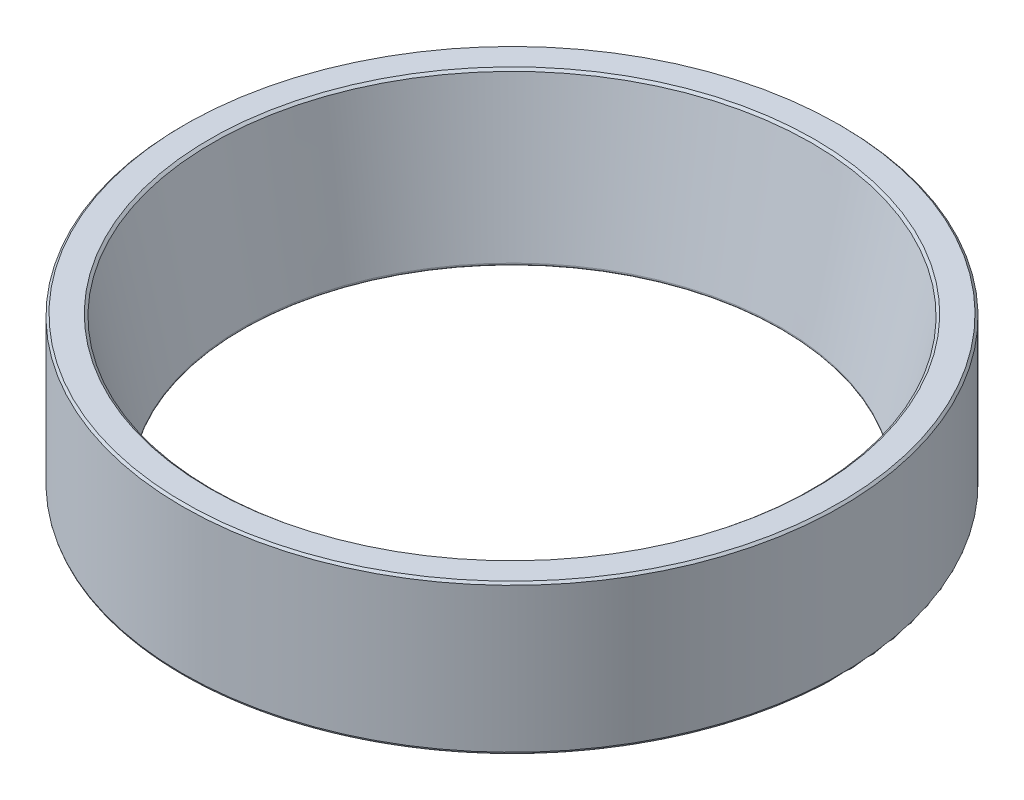
ISO-10303-21;
HEADER;
FILE_DESCRIPTION(('STEP AP214'),'2;1');
FILE_NAME('part.step','',(''),(''),'','','');
FILE_SCHEMA(('AUTOMOTIVE_DESIGN { 1 0 10303 214 1 1 1 1 }'));
ENDSEC;
DATA;
#1=APPLICATION_CONTEXT('core data for automotive mechanical design processes');
#2=APPLICATION_PROTOCOL_DEFINITION('international standard','automotive_design',2000,#1);
#3=PRODUCT_CONTEXT('',#1,'mechanical');
#4=PRODUCT('Part','Part','',(#3));
#5=PRODUCT_RELATED_PRODUCT_CATEGORY('part','',(#4));
#6=PRODUCT_DEFINITION_FORMATION('','',#4);
#7=PRODUCT_DEFINITION_CONTEXT('part definition',#1,'design');
#8=PRODUCT_DEFINITION('design','',#6,#7);
#9=PRODUCT_DEFINITION_SHAPE('','',#8);
#10=(LENGTH_UNIT() NAMED_UNIT(*) SI_UNIT(.MILLI.,.METRE.));
#11=(NAMED_UNIT(*) PLANE_ANGLE_UNIT() SI_UNIT($,.RADIAN.));
#12=(NAMED_UNIT(*) SI_UNIT($,.STERADIAN.) SOLID_ANGLE_UNIT());
#13=UNCERTAINTY_MEASURE_WITH_UNIT(LENGTH_MEASURE(1.E-05),#10,'distance_accuracy_value','');
#14=(GEOMETRIC_REPRESENTATION_CONTEXT(3) GLOBAL_UNCERTAINTY_ASSIGNED_CONTEXT((#13)) GLOBAL_UNIT_ASSIGNED_CONTEXT((#10,
#11,#12)) REPRESENTATION_CONTEXT('',''));
#15=CARTESIAN_POINT('',(0.,0.,0.));
#16=DIRECTION('',(0.,0.,1.));
#17=DIRECTION('',(1.,0.,0.));
#18=AXIS2_PLACEMENT_3D('',#15,#16,#17);
#19=CARTESIAN_POINT('',(0.,13.8044395171845,0.));
#20=DIRECTION('',(0.,1.,0.));
#21=DIRECTION('',(0.,0.,1.));
#22=AXIS2_PLACEMENT_3D('',#19,#20,#21);
#23=CONICAL_SURFACE('',#22,28.2080941822538,0.890944830008821);
#24=CARTESIAN_POINT('',(0.,14.,0.));
#25=DIRECTION('',(0.,-1.,0.));
#26=DIRECTION('',(0.,0.,-1.));
#27=AXIS2_PLACEMENT_3D('',#24,#25,#26);
#28=CIRCLE('',#27,28.45);
#29=CARTESIAN_POINT('',(0.,14.,-28.45));
#30=VERTEX_POINT('',#29);
#31=EDGE_CURVE('E10',#30,#30,#28,.T.);
#32=ORIENTED_EDGE('',*,*,#31,.F.);
#33=EDGE_LOOP('',(#32));
#34=FACE_BOUND('',#33,.T.);
#35=CARTESIAN_POINT('',(0.,13.8044395171845,0.));
#36=DIRECTION('',(0.,-1.,0.));
#37=DIRECTION('',(0.,0.,-1.));
#38=AXIS2_PLACEMENT_3D('',#35,#36,#37);
#39=CIRCLE('',#38,28.2080941822538);
#40=CARTESIAN_POINT('',(0.,13.8044395171845,-28.2080941822538));
#41=VERTEX_POINT('',#40);
#42=EDGE_CURVE('E58',#41,#41,#39,.T.);
#43=ORIENTED_EDGE('',*,*,#42,.T.);
#44=EDGE_LOOP('',(#43));
#45=FACE_BOUND('',#44,.T.);
#46=ADVANCED_FACE('F30',(#34,#45),#23,.F.);
#47=CARTESIAN_POINT('',(-30.8,14.,0.));
#48=DIRECTION('',(0.,-1.,0.));
#49=DIRECTION('',(0.,0.,-1.));
#50=AXIS2_PLACEMENT_3D('',#47,#48,#49);
#51=PLANE('',#50);
#52=CARTESIAN_POINT('',(0.,14.,0.));
#53=DIRECTION('',(0.,-1.,0.));
#54=DIRECTION('',(0.,0.,-1.));
#55=AXIS2_PLACEMENT_3D('',#52,#53,#54);
#56=CIRCLE('',#55,30.8);
#57=CARTESIAN_POINT('',(0.,14.,-30.8));
#58=VERTEX_POINT('',#57);
#59=EDGE_CURVE('E36',#58,#58,#56,.T.);
#60=ORIENTED_EDGE('',*,*,#59,.F.);
#61=EDGE_LOOP('',(#60));
#62=FACE_BOUND('',#61,.T.);
#63=ORIENTED_EDGE('',*,*,#31,.T.);
#64=EDGE_LOOP('',(#63));
#65=FACE_BOUND('',#64,.T.);
#66=ADVANCED_FACE('F95',(#62,#65),#51,.F.);
#67=CARTESIAN_POINT('',(0.,14.,0.));
#68=DIRECTION('',(0.,-1.,0.));
#69=DIRECTION('',(0.,0.,-1.));
#70=AXIS2_PLACEMENT_3D('',#67,#68,#69);
#71=CONICAL_SURFACE('',#70,30.8,0.785398163397444);
#72=CARTESIAN_POINT('',(0.,13.8,0.));
#73=DIRECTION('',(0.,-1.,0.));
#74=DIRECTION('',(0.,0.,-1.));
#75=AXIS2_PLACEMENT_3D('',#72,#73,#74);
#76=CIRCLE('',#75,31.);
#77=CARTESIAN_POINT('',(0.,13.8,-31.));
#78=VERTEX_POINT('',#77);
#79=EDGE_CURVE('E40',#78,#78,#76,.T.);
#80=ORIENTED_EDGE('',*,*,#79,.F.);
#81=EDGE_LOOP('',(#80));
#82=FACE_BOUND('',#81,.T.);
#83=ORIENTED_EDGE('',*,*,#59,.T.);
#84=EDGE_LOOP('',(#83));
#85=FACE_BOUND('',#84,.T.);
#86=ADVANCED_FACE('F90',(#82,#85),#71,.T.);
#87=CARTESIAN_POINT('',(0.,0.,0.));
#88=DIRECTION('',(0.,-1.,0.));
#89=DIRECTION('',(0.,0.,-1.));
#90=AXIS2_PLACEMENT_3D('',#87,#88,#89);
#91=CYLINDRICAL_SURFACE('',#90,31.);
#92=CARTESIAN_POINT('',(0.,0.200000000000001,0.));
#93=DIRECTION('',(0.,-1.,0.));
#94=DIRECTION('',(0.,0.,-1.));
#95=AXIS2_PLACEMENT_3D('',#92,#93,#94);
#96=CIRCLE('',#95,31.);
#97=CARTESIAN_POINT('',(0.,0.200000000000001,-31.));
#98=VERTEX_POINT('',#97);
#99=EDGE_CURVE('E44',#98,#98,#96,.T.);
#100=ORIENTED_EDGE('',*,*,#99,.F.);
#101=EDGE_LOOP('',(#100));
#102=FACE_BOUND('',#101,.T.);
#103=ORIENTED_EDGE('',*,*,#79,.T.);
#104=EDGE_LOOP('',(#103));
#105=FACE_BOUND('',#104,.T.);
#106=ADVANCED_FACE('F84',(#102,#105),#91,.T.);
#107=CARTESIAN_POINT('',(0.,0.2,0.));
#108=DIRECTION('',(0.,-1.,0.));
#109=DIRECTION('',(0.,0.,-1.));
#110=AXIS2_PLACEMENT_3D('',#107,#108,#109);
#111=TOROIDAL_SURFACE('',#110,30.8,0.199999999999999);
#112=CARTESIAN_POINT('',(0.,0.,0.));
#113=DIRECTION('',(0.,-1.,0.));
#114=DIRECTION('',(0.,0.,-1.));
#115=AXIS2_PLACEMENT_3D('',#112,#113,#114);
#116=CIRCLE('',#115,30.8);
#117=CARTESIAN_POINT('',(0.,0.,-30.8));
#118=VERTEX_POINT('',#117);
#119=EDGE_CURVE('E49',#118,#118,#116,.T.);
#120=ORIENTED_EDGE('',*,*,#119,.F.);
#121=EDGE_LOOP('',(#120));
#122=FACE_BOUND('',#121,.T.);
#123=ORIENTED_EDGE('',*,*,#99,.T.);
#124=EDGE_LOOP('',(#123));
#125=FACE_BOUND('',#124,.T.);
#126=ADVANCED_FACE('F78',(#122,#125),#111,.T.);
#127=CARTESIAN_POINT('',(-25.4973974437611,0.,0.));
#128=DIRECTION('',(0.,1.,0.));
#129=DIRECTION('',(0.,0.,1.));
#130=AXIS2_PLACEMENT_3D('',#127,#128,#129);
#131=PLANE('',#130);
#132=CARTESIAN_POINT('',(0.,0.,0.));
#133=DIRECTION('',(0.,-1.,0.));
#134=DIRECTION('',(0.,0.,-1.));
#135=AXIS2_PLACEMENT_3D('',#132,#133,#134);
#136=CIRCLE('',#135,25.4973974437611);
#137=CARTESIAN_POINT('',(0.,0.,-25.4973974437611));
#138=VERTEX_POINT('',#137);
#139=EDGE_CURVE('E52',#138,#138,#136,.T.);
#140=ORIENTED_EDGE('',*,*,#139,.F.);
#141=EDGE_LOOP('',(#140));
#142=FACE_BOUND('',#141,.T.);
#143=ORIENTED_EDGE('',*,*,#119,.T.);
#144=EDGE_LOOP('',(#143));
#145=FACE_BOUND('',#144,.T.);
#146=ADVANCED_FACE('F72',(#142,#145),#131,.F.);
#147=CARTESIAN_POINT('',(0.,0.2,0.));
#148=DIRECTION('',(0.,-1.,0.));
#149=DIRECTION('',(0.,0.,-1.));
#150=AXIS2_PLACEMENT_3D('',#147,#148,#149);
#151=TOROIDAL_SURFACE('',#150,25.4973974437611,0.199999999999999);
#152=CARTESIAN_POINT('',(0.,0.241905817746177,0.));
#153=DIRECTION('',(0.,-1.,0.));
#154=DIRECTION('',(0.,0.,-1.));
#155=AXIS2_PLACEMENT_3D('',#152,#153,#154);
#156=CIRCLE('',#155,25.3018369609456);
#157=CARTESIAN_POINT('',(0.,0.241905817746177,-25.3018369609456));
#158=VERTEX_POINT('',#157);
#159=EDGE_CURVE('E55',#158,#158,#156,.T.);
#160=ORIENTED_EDGE('',*,*,#159,.F.);
#161=EDGE_LOOP('',(#160));
#162=FACE_BOUND('',#161,.T.);
#163=ORIENTED_EDGE('',*,*,#139,.T.);
#164=EDGE_LOOP('',(#163));
#165=FACE_BOUND('',#164,.T.);
#166=ADVANCED_FACE('F66',(#162,#165),#151,.T.);
#167=CARTESIAN_POINT('',(0.,0.241905817746177,0.));
#168=DIRECTION('',(0.,1.,0.));
#169=DIRECTION('',(0.,0.,1.));
#170=AXIS2_PLACEMENT_3D('',#167,#168,#169);
#171=CONICAL_SURFACE('',#170,25.3018369609456,0.211093333222747);
#172=ORIENTED_EDGE('',*,*,#42,.F.);
#173=EDGE_LOOP('',(#172));
#174=FACE_BOUND('',#173,.T.);
#175=ORIENTED_EDGE('',*,*,#159,.T.);
#176=EDGE_LOOP('',(#175));
#177=FACE_BOUND('',#176,.T.);
#178=ADVANCED_FACE('F63',(#174,#177),#171,.F.);
#179=CLOSED_SHELL('',(#46,#66,#86,#106,#126,#146,#166,#178));
#180=MANIFOLD_SOLID_BREP('B2',#179);
#181=ADVANCED_BREP_SHAPE_REPRESENTATION('',(#18,#180),#14);
#182=SHAPE_DEFINITION_REPRESENTATION(#9,#181);
ENDSEC;
END-ISO-10303-21;
